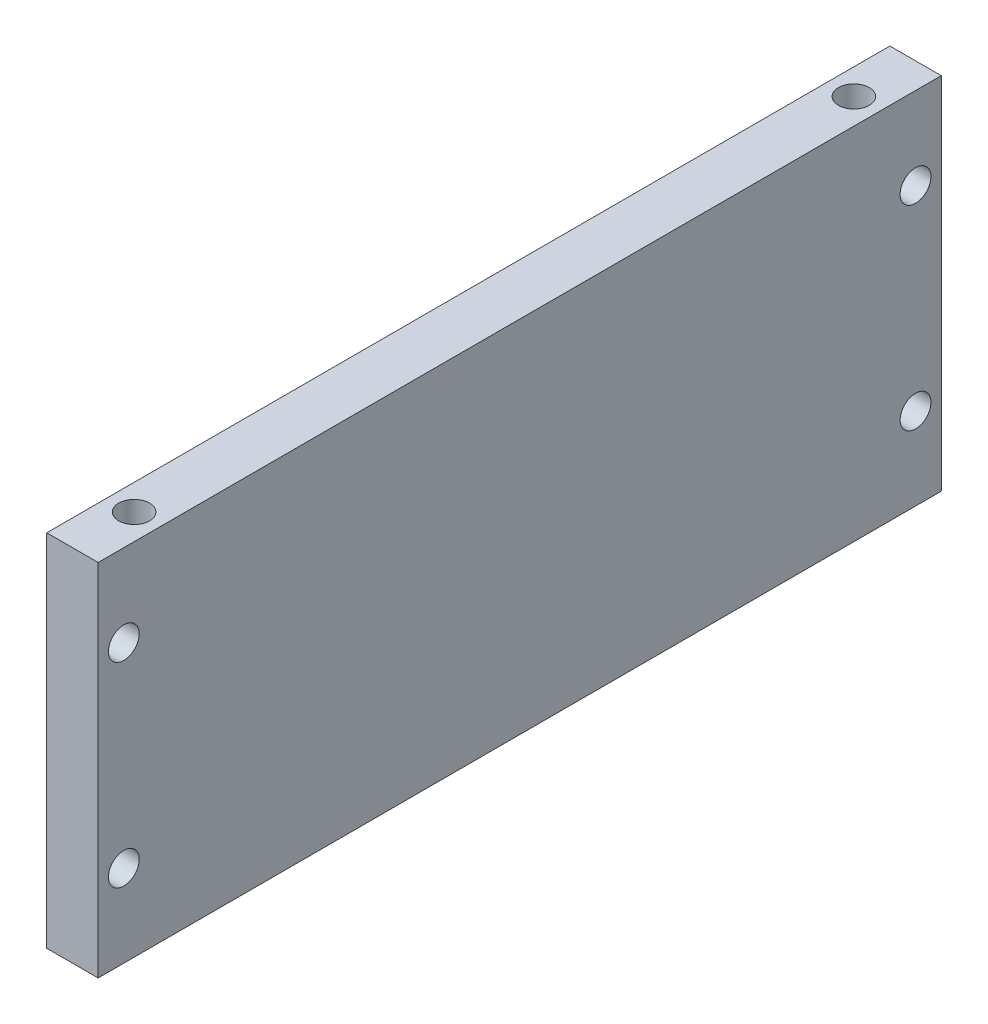
ISO-10303-21;
HEADER;
FILE_DESCRIPTION(('STEP AP214'),'2;1');
FILE_NAME('part.step','',(''),(''),'','','');
FILE_SCHEMA(('AUTOMOTIVE_DESIGN { 1 0 10303 214 1 1 1 1 }'));
ENDSEC;
DATA;
#1=APPLICATION_CONTEXT('core data for automotive mechanical design processes');
#2=APPLICATION_PROTOCOL_DEFINITION('international standard','automotive_design',2000,#1);
#3=PRODUCT_CONTEXT('',#1,'mechanical');
#4=PRODUCT('Part','Part','',(#3));
#5=PRODUCT_RELATED_PRODUCT_CATEGORY('part','',(#4));
#6=PRODUCT_DEFINITION_FORMATION('','',#4);
#7=PRODUCT_DEFINITION_CONTEXT('part definition',#1,'design');
#8=PRODUCT_DEFINITION('design','',#6,#7);
#9=PRODUCT_DEFINITION_SHAPE('','',#8);
#10=(LENGTH_UNIT() NAMED_UNIT(*) SI_UNIT(.MILLI.,.METRE.));
#11=(NAMED_UNIT(*) PLANE_ANGLE_UNIT() SI_UNIT($,.RADIAN.));
#12=(NAMED_UNIT(*) SI_UNIT($,.STERADIAN.) SOLID_ANGLE_UNIT());
#13=UNCERTAINTY_MEASURE_WITH_UNIT(LENGTH_MEASURE(1.E-05),#10,'distance_accuracy_value','');
#14=(GEOMETRIC_REPRESENTATION_CONTEXT(3) GLOBAL_UNCERTAINTY_ASSIGNED_CONTEXT((#13)) GLOBAL_UNIT_ASSIGNED_CONTEXT((#10,
#11,#12)) REPRESENTATION_CONTEXT('',''));
#15=CARTESIAN_POINT('',(0.,0.,0.));
#16=DIRECTION('',(0.,0.,1.));
#17=DIRECTION('',(1.,0.,0.));
#18=AXIS2_PLACEMENT_3D('',#15,#16,#17);
#19=CARTESIAN_POINT('',(5.,-17.5,-41.));
#20=DIRECTION('',(0.,0.,1.));
#21=DIRECTION('',(1.,0.,0.));
#22=AXIS2_PLACEMENT_3D('',#19,#20,#21);
#23=PLANE('',#22);
#24=DIRECTION('',(0.,1.,0.));
#25=VECTOR('',#24,1.);
#26=CARTESIAN_POINT('',(0.,-17.5,-41.));
#27=LINE('',#26,#25);
#28=CARTESIAN_POINT('',(0.,-17.5,-41.));
#29=VERTEX_POINT('',#28);
#30=CARTESIAN_POINT('',(0.,17.5,-41.));
#31=VERTEX_POINT('',#30);
#32=EDGE_CURVE('E104',#29,#31,#27,.T.);
#33=ORIENTED_EDGE('',*,*,#32,.T.);
#34=DIRECTION('',(-1.,0.,0.));
#35=VECTOR('',#34,1.);
#36=CARTESIAN_POINT('',(5.,17.5,-41.));
#37=LINE('',#36,#35);
#38=CARTESIAN_POINT('',(5.,17.5,-41.));
#39=VERTEX_POINT('',#38);
#40=EDGE_CURVE('E11',#39,#31,#37,.T.);
#41=ORIENTED_EDGE('',*,*,#40,.F.);
#42=DIRECTION('',(0.,1.,0.));
#43=VECTOR('',#42,1.);
#44=CARTESIAN_POINT('',(5.,-17.5,-41.));
#45=LINE('',#44,#43);
#46=CARTESIAN_POINT('',(5.,-17.5,-41.));
#47=VERTEX_POINT('',#46);
#48=EDGE_CURVE('E92',#47,#39,#45,.T.);
#49=ORIENTED_EDGE('',*,*,#48,.F.);
#50=DIRECTION('',(-1.,0.,0.));
#51=VECTOR('',#50,1.);
#52=CARTESIAN_POINT('',(5.,-17.5,-41.));
#53=LINE('',#52,#51);
#54=EDGE_CURVE('E100',#47,#29,#53,.T.);
#55=ORIENTED_EDGE('',*,*,#54,.T.);
#56=EDGE_LOOP('',(#33,#41,#49,#55));
#57=FACE_BOUND('',#56,.T.);
#58=ADVANCED_FACE('F41',(#57),#23,.F.);
#59=CARTESIAN_POINT('',(5.,17.5,41.));
#60=DIRECTION('',(0.,-1.,0.));
#61=DIRECTION('',(0.,0.,-1.));
#62=AXIS2_PLACEMENT_3D('',#59,#60,#61);
#63=PLANE('',#62);
#64=CARTESIAN_POINT('',(2.5,17.5,35.));
#65=DIRECTION('',(0.,1.,0.));
#66=DIRECTION('',(0.,0.,1.));
#67=AXIS2_PLACEMENT_3D('',#64,#65,#66);
#68=CIRCLE('',#67,1.5);
#69=CARTESIAN_POINT('',(2.5,17.5,36.5));
#70=VERTEX_POINT('',#69);
#71=EDGE_CURVE('E160',#70,#70,#68,.T.);
#72=ORIENTED_EDGE('',*,*,#71,.F.);
#73=EDGE_LOOP('',(#72));
#74=FACE_BOUND('',#73,.T.);
#75=CARTESIAN_POINT('',(2.5,17.5,-35.));
#76=DIRECTION('',(0.,1.,0.));
#77=DIRECTION('',(0.,0.,-1.));
#78=AXIS2_PLACEMENT_3D('',#75,#76,#77);
#79=CIRCLE('',#78,1.5);
#80=CARTESIAN_POINT('',(2.5,17.5,-36.5));
#81=VERTEX_POINT('',#80);
#82=EDGE_CURVE('E157',#81,#81,#79,.T.);
#83=ORIENTED_EDGE('',*,*,#82,.F.);
#84=EDGE_LOOP('',(#83));
#85=FACE_BOUND('',#84,.T.);
#86=DIRECTION('',(0.,0.,1.));
#87=VECTOR('',#86,1.);
#88=CARTESIAN_POINT('',(0.,17.5,41.));
#89=LINE('',#88,#87);
#90=CARTESIAN_POINT('',(0.,17.5,41.));
#91=VERTEX_POINT('',#90);
#92=EDGE_CURVE('E96',#31,#91,#89,.T.);
#93=ORIENTED_EDGE('',*,*,#92,.T.);
#94=DIRECTION('',(-1.,0.,0.));
#95=VECTOR('',#94,1.);
#96=CARTESIAN_POINT('',(5.,17.5,41.));
#97=LINE('',#96,#95);
#98=CARTESIAN_POINT('',(5.,17.5,41.));
#99=VERTEX_POINT('',#98);
#100=EDGE_CURVE('E49',#99,#91,#97,.T.);
#101=ORIENTED_EDGE('',*,*,#100,.F.);
#102=DIRECTION('',(0.,0.,1.));
#103=VECTOR('',#102,1.);
#104=CARTESIAN_POINT('',(5.,17.5,41.));
#105=LINE('',#104,#103);
#106=EDGE_CURVE('E87',#39,#99,#105,.T.);
#107=ORIENTED_EDGE('',*,*,#106,.F.);
#108=ORIENTED_EDGE('',*,*,#40,.T.);
#109=EDGE_LOOP('',(#93,#101,#107,#108));
#110=FACE_BOUND('',#109,.T.);
#111=ADVANCED_FACE('F95',(#74,#85,#110),#63,.F.);
#112=CARTESIAN_POINT('',(5.,-17.5,41.));
#113=DIRECTION('',(0.,0.,-1.));
#114=DIRECTION('',(-1.,0.,0.));
#115=AXIS2_PLACEMENT_3D('',#112,#113,#114);
#116=PLANE('',#115);
#117=DIRECTION('',(0.,-1.,0.));
#118=VECTOR('',#117,1.);
#119=CARTESIAN_POINT('',(0.,-17.5,41.));
#120=LINE('',#119,#118);
#121=CARTESIAN_POINT('',(0.,-17.5,41.));
#122=VERTEX_POINT('',#121);
#123=EDGE_CURVE('E74',#91,#122,#120,.T.);
#124=ORIENTED_EDGE('',*,*,#123,.T.);
#125=DIRECTION('',(-1.,0.,0.));
#126=VECTOR('',#125,1.);
#127=CARTESIAN_POINT('',(5.,-17.5,41.));
#128=LINE('',#127,#126);
#129=CARTESIAN_POINT('',(5.,-17.5,41.));
#130=VERTEX_POINT('',#129);
#131=EDGE_CURVE('E97',#130,#122,#128,.T.);
#132=ORIENTED_EDGE('',*,*,#131,.F.);
#133=DIRECTION('',(0.,-1.,0.));
#134=VECTOR('',#133,1.);
#135=CARTESIAN_POINT('',(5.,-17.5,41.));
#136=LINE('',#135,#134);
#137=EDGE_CURVE('E90',#99,#130,#136,.T.);
#138=ORIENTED_EDGE('',*,*,#137,.F.);
#139=ORIENTED_EDGE('',*,*,#100,.T.);
#140=EDGE_LOOP('',(#124,#132,#138,#139));
#141=FACE_BOUND('',#140,.T.);
#142=ADVANCED_FACE('F98',(#141),#116,.F.);
#143=CARTESIAN_POINT('',(5.,-17.5,41.));
#144=DIRECTION('',(0.,1.,0.));
#145=DIRECTION('',(0.,0.,1.));
#146=AXIS2_PLACEMENT_3D('',#143,#144,#145);
#147=PLANE('',#146);
#148=CARTESIAN_POINT('',(2.5,-17.5,35.));
#149=DIRECTION('',(0.,-1.,0.));
#150=DIRECTION('',(0.,0.,-1.));
#151=AXIS2_PLACEMENT_3D('',#148,#149,#150);
#152=CIRCLE('',#151,1.5);
#153=CARTESIAN_POINT('',(2.5,-17.5,33.5));
#154=VERTEX_POINT('',#153);
#155=EDGE_CURVE('E149',#154,#154,#152,.T.);
#156=ORIENTED_EDGE('',*,*,#155,.F.);
#157=EDGE_LOOP('',(#156));
#158=FACE_BOUND('',#157,.T.);
#159=CARTESIAN_POINT('',(2.5,-17.5,-35.));
#160=DIRECTION('',(0.,-1.,0.));
#161=DIRECTION('',(0.,0.,1.));
#162=AXIS2_PLACEMENT_3D('',#159,#160,#161);
#163=CIRCLE('',#162,1.5);
#164=CARTESIAN_POINT('',(2.5,-17.5,-33.5));
#165=VERTEX_POINT('',#164);
#166=EDGE_CURVE('E145',#165,#165,#163,.T.);
#167=ORIENTED_EDGE('',*,*,#166,.F.);
#168=EDGE_LOOP('',(#167));
#169=FACE_BOUND('',#168,.T.);
#170=DIRECTION('',(0.,0.,-1.));
#171=VECTOR('',#170,1.);
#172=CARTESIAN_POINT('',(0.,-17.5,41.));
#173=LINE('',#172,#171);
#174=EDGE_CURVE('E80',#122,#29,#173,.T.);
#175=ORIENTED_EDGE('',*,*,#174,.T.);
#176=ORIENTED_EDGE('',*,*,#54,.F.);
#177=DIRECTION('',(0.,0.,-1.));
#178=VECTOR('',#177,1.);
#179=CARTESIAN_POINT('',(5.,-17.5,41.));
#180=LINE('',#179,#178);
#181=EDGE_CURVE('E57',#130,#47,#180,.T.);
#182=ORIENTED_EDGE('',*,*,#181,.F.);
#183=ORIENTED_EDGE('',*,*,#131,.T.);
#184=EDGE_LOOP('',(#175,#176,#182,#183));
#185=FACE_BOUND('',#184,.T.);
#186=ADVANCED_FACE('F112',(#158,#169,#185),#147,.F.);
#187=CARTESIAN_POINT('',(5.,0.,0.));
#188=DIRECTION('',(-1.,0.,0.));
#189=DIRECTION('',(0.,0.,1.));
#190=AXIS2_PLACEMENT_3D('',#187,#188,#189);
#191=PLANE('',#190);
#192=CARTESIAN_POINT('',(5.,9.49999999999999,-38.5));
#193=DIRECTION('',(1.,0.,0.));
#194=DIRECTION('',(0.,0.,1.));
#195=AXIS2_PLACEMENT_3D('',#192,#193,#194);
#196=CIRCLE('',#195,1.5);
#197=CARTESIAN_POINT('',(5.,9.49999999999999,-37.));
#198=VERTEX_POINT('',#197);
#199=EDGE_CURVE('E127',#198,#198,#196,.T.);
#200=ORIENTED_EDGE('',*,*,#199,.F.);
#201=EDGE_LOOP('',(#200));
#202=FACE_BOUND('',#201,.T.);
#203=CARTESIAN_POINT('',(5.,-9.49999999999999,-38.5));
#204=DIRECTION('',(1.,0.,0.));
#205=DIRECTION('',(0.,0.,-1.));
#206=AXIS2_PLACEMENT_3D('',#203,#204,#205);
#207=CIRCLE('',#206,1.5);
#208=CARTESIAN_POINT('',(5.,-9.49999999999999,-40.));
#209=VERTEX_POINT('',#208);
#210=EDGE_CURVE('E134',#209,#209,#207,.T.);
#211=ORIENTED_EDGE('',*,*,#210,.F.);
#212=EDGE_LOOP('',(#211));
#213=FACE_BOUND('',#212,.T.);
#214=CARTESIAN_POINT('',(5.,-9.49999999999999,38.5));
#215=DIRECTION('',(1.,0.,0.));
#216=DIRECTION('',(0.,0.,1.));
#217=AXIS2_PLACEMENT_3D('',#214,#215,#216);
#218=CIRCLE('',#217,1.5);
#219=CARTESIAN_POINT('',(5.,-9.49999999999999,40.));
#220=VERTEX_POINT('',#219);
#221=EDGE_CURVE('E121',#220,#220,#218,.T.);
#222=ORIENTED_EDGE('',*,*,#221,.F.);
#223=EDGE_LOOP('',(#222));
#224=FACE_BOUND('',#223,.T.);
#225=CARTESIAN_POINT('',(5.,9.49999999999999,38.5));
#226=DIRECTION('',(1.,0.,0.));
#227=DIRECTION('',(0.,0.,-1.));
#228=AXIS2_PLACEMENT_3D('',#225,#226,#227);
#229=CIRCLE('',#228,1.5);
#230=CARTESIAN_POINT('',(5.,9.49999999999999,37.));
#231=VERTEX_POINT('',#230);
#232=EDGE_CURVE('E118',#231,#231,#229,.T.);
#233=ORIENTED_EDGE('',*,*,#232,.F.);
#234=EDGE_LOOP('',(#233));
#235=FACE_BOUND('',#234,.T.);
#236=ORIENTED_EDGE('',*,*,#48,.T.);
#237=ORIENTED_EDGE('',*,*,#106,.T.);
#238=ORIENTED_EDGE('',*,*,#137,.T.);
#239=ORIENTED_EDGE('',*,*,#181,.T.);
#240=EDGE_LOOP('',(#236,#237,#238,#239));
#241=FACE_BOUND('',#240,.T.);
#242=ADVANCED_FACE('F88',(#202,#213,#224,#235,#241),#191,.F.);
#243=CARTESIAN_POINT('',(0.,0.,0.));
#244=DIRECTION('',(-1.,0.,0.));
#245=DIRECTION('',(0.,0.,1.));
#246=AXIS2_PLACEMENT_3D('',#243,#244,#245);
#247=PLANE('',#246);
#248=ORIENTED_EDGE('',*,*,#32,.F.);
#249=ORIENTED_EDGE('',*,*,#174,.F.);
#250=ORIENTED_EDGE('',*,*,#123,.F.);
#251=ORIENTED_EDGE('',*,*,#92,.F.);
#252=EDGE_LOOP('',(#248,#249,#250,#251));
#253=FACE_BOUND('',#252,.T.);
#254=ADVANCED_FACE('F115',(#253),#247,.T.);
#255=CARTESIAN_POINT('',(1.,9.49999999999999,38.5));
#256=DIRECTION('',(1.,0.,0.));
#257=DIRECTION('',(0.,0.,-1.));
#258=AXIS2_PLACEMENT_3D('',#255,#256,#257);
#259=CYLINDRICAL_SURFACE('',#258,1.5);
#260=CARTESIAN_POINT('',(1.,9.49999999999999,38.5));
#261=DIRECTION('',(1.,0.,0.));
#262=DIRECTION('',(0.,0.,-1.));
#263=AXIS2_PLACEMENT_3D('',#260,#261,#262);
#264=CIRCLE('',#263,1.5);
#265=CARTESIAN_POINT('',(1.,9.49999999999999,37.));
#266=VERTEX_POINT('',#265);
#267=EDGE_CURVE('E107',#266,#266,#264,.T.);
#268=ORIENTED_EDGE('',*,*,#267,.F.);
#269=EDGE_LOOP('',(#268));
#270=FACE_BOUND('',#269,.T.);
#271=ORIENTED_EDGE('',*,*,#232,.T.);
#272=EDGE_LOOP('',(#271));
#273=FACE_BOUND('',#272,.T.);
#274=ADVANCED_FACE('F231',(#270,#273),#259,.F.);
#275=CARTESIAN_POINT('',(1.,9.49999999999999,38.5));
#276=DIRECTION('',(1.,0.,0.));
#277=DIRECTION('',(0.,0.,-1.));
#278=AXIS2_PLACEMENT_3D('',#275,#276,#277);
#279=PLANE('',#278);
#280=ORIENTED_EDGE('',*,*,#267,.T.);
#281=EDGE_LOOP('',(#280));
#282=FACE_BOUND('',#281,.T.);
#283=ADVANCED_FACE('F237',(#282),#279,.T.);
#284=CARTESIAN_POINT('',(1.,-9.49999999999999,38.5));
#285=DIRECTION('',(1.,0.,0.));
#286=DIRECTION('',(0.,0.,-1.));
#287=AXIS2_PLACEMENT_3D('',#284,#285,#286);
#288=CYLINDRICAL_SURFACE('',#287,1.5);
#289=CARTESIAN_POINT('',(1.,-9.49999999999999,38.5));
#290=DIRECTION('',(1.,0.,0.));
#291=DIRECTION('',(0.,0.,1.));
#292=AXIS2_PLACEMENT_3D('',#289,#290,#291);
#293=CIRCLE('',#292,1.5);
#294=CARTESIAN_POINT('',(1.,-9.49999999999999,40.));
#295=VERTEX_POINT('',#294);
#296=EDGE_CURVE('E137',#295,#295,#293,.T.);
#297=ORIENTED_EDGE('',*,*,#296,.F.);
#298=EDGE_LOOP('',(#297));
#299=FACE_BOUND('',#298,.T.);
#300=ORIENTED_EDGE('',*,*,#221,.T.);
#301=EDGE_LOOP('',(#300));
#302=FACE_BOUND('',#301,.T.);
#303=ADVANCED_FACE('F245',(#299,#302),#288,.F.);
#304=CARTESIAN_POINT('',(1.,-9.49999999999999,38.5));
#305=DIRECTION('',(-1.,0.,0.));
#306=DIRECTION('',(0.,0.,1.));
#307=AXIS2_PLACEMENT_3D('',#304,#305,#306);
#308=PLANE('',#307);
#309=ORIENTED_EDGE('',*,*,#296,.T.);
#310=EDGE_LOOP('',(#309));
#311=FACE_BOUND('',#310,.T.);
#312=ADVANCED_FACE('F253',(#311),#308,.F.);
#313=CARTESIAN_POINT('',(1.,-9.49999999999999,-38.5));
#314=DIRECTION('',(1.,0.,0.));
#315=DIRECTION('',(0.,0.,-1.));
#316=AXIS2_PLACEMENT_3D('',#313,#314,#315);
#317=CYLINDRICAL_SURFACE('',#316,1.5);
#318=CARTESIAN_POINT('',(1.,-9.49999999999999,-38.5));
#319=DIRECTION('',(1.,0.,0.));
#320=DIRECTION('',(0.,0.,-1.));
#321=AXIS2_PLACEMENT_3D('',#318,#319,#320);
#322=CIRCLE('',#321,1.5);
#323=CARTESIAN_POINT('',(1.,-9.49999999999999,-40.));
#324=VERTEX_POINT('',#323);
#325=EDGE_CURVE('E131',#324,#324,#322,.T.);
#326=ORIENTED_EDGE('',*,*,#325,.F.);
#327=EDGE_LOOP('',(#326));
#328=FACE_BOUND('',#327,.T.);
#329=ORIENTED_EDGE('',*,*,#210,.T.);
#330=EDGE_LOOP('',(#329));
#331=FACE_BOUND('',#330,.T.);
#332=ADVANCED_FACE('F261',(#328,#331),#317,.F.);
#333=CARTESIAN_POINT('',(1.,-9.49999999999999,-38.5));
#334=DIRECTION('',(1.,0.,0.));
#335=DIRECTION('',(0.,0.,-1.));
#336=AXIS2_PLACEMENT_3D('',#333,#334,#335);
#337=PLANE('',#336);
#338=ORIENTED_EDGE('',*,*,#325,.T.);
#339=EDGE_LOOP('',(#338));
#340=FACE_BOUND('',#339,.T.);
#341=ADVANCED_FACE('F269',(#340),#337,.T.);
#342=CARTESIAN_POINT('',(1.,9.49999999999999,-38.5));
#343=DIRECTION('',(1.,0.,0.));
#344=DIRECTION('',(0.,0.,-1.));
#345=AXIS2_PLACEMENT_3D('',#342,#343,#344);
#346=CYLINDRICAL_SURFACE('',#345,1.5);
#347=CARTESIAN_POINT('',(1.,9.49999999999999,-38.5));
#348=DIRECTION('',(1.,0.,0.));
#349=DIRECTION('',(0.,0.,1.));
#350=AXIS2_PLACEMENT_3D('',#347,#348,#349);
#351=CIRCLE('',#350,1.5);
#352=CARTESIAN_POINT('',(1.,9.49999999999999,-37.));
#353=VERTEX_POINT('',#352);
#354=EDGE_CURVE('E124',#353,#353,#351,.T.);
#355=ORIENTED_EDGE('',*,*,#354,.F.);
#356=EDGE_LOOP('',(#355));
#357=FACE_BOUND('',#356,.T.);
#358=ORIENTED_EDGE('',*,*,#199,.T.);
#359=EDGE_LOOP('',(#358));
#360=FACE_BOUND('',#359,.T.);
#361=ADVANCED_FACE('F277',(#357,#360),#346,.F.);
#362=CARTESIAN_POINT('',(1.,9.49999999999999,-38.5));
#363=DIRECTION('',(-1.,0.,0.));
#364=DIRECTION('',(0.,0.,1.));
#365=AXIS2_PLACEMENT_3D('',#362,#363,#364);
#366=PLANE('',#365);
#367=ORIENTED_EDGE('',*,*,#354,.T.);
#368=EDGE_LOOP('',(#367));
#369=FACE_BOUND('',#368,.T.);
#370=ADVANCED_FACE('F285',(#369),#366,.F.);
#371=CARTESIAN_POINT('',(2.5,-13.5,-35.));
#372=DIRECTION('',(0.,-1.,0.));
#373=DIRECTION('',(0.,0.,-1.));
#374=AXIS2_PLACEMENT_3D('',#371,#372,#373);
#375=CYLINDRICAL_SURFACE('',#374,1.5);
#376=CARTESIAN_POINT('',(2.5,-13.5,-35.));
#377=DIRECTION('',(0.,-1.,0.));
#378=DIRECTION('',(0.,0.,1.));
#379=AXIS2_PLACEMENT_3D('',#376,#377,#378);
#380=CIRCLE('',#379,1.5);
#381=CARTESIAN_POINT('',(2.5,-13.5,-33.5));
#382=VERTEX_POINT('',#381);
#383=EDGE_CURVE('E142',#382,#382,#380,.T.);
#384=ORIENTED_EDGE('',*,*,#383,.F.);
#385=EDGE_LOOP('',(#384));
#386=FACE_BOUND('',#385,.T.);
#387=ORIENTED_EDGE('',*,*,#166,.T.);
#388=EDGE_LOOP('',(#387));
#389=FACE_BOUND('',#388,.T.);
#390=ADVANCED_FACE('F292',(#386,#389),#375,.F.);
#391=CARTESIAN_POINT('',(2.5,-13.5,-35.));
#392=DIRECTION('',(0.,1.,0.));
#393=DIRECTION('',(0.,0.,1.));
#394=AXIS2_PLACEMENT_3D('',#391,#392,#393);
#395=PLANE('',#394);
#396=ORIENTED_EDGE('',*,*,#383,.T.);
#397=EDGE_LOOP('',(#396));
#398=FACE_BOUND('',#397,.T.);
#399=ADVANCED_FACE('F299',(#398),#395,.F.);
#400=CARTESIAN_POINT('',(2.5,-13.5,35.));
#401=DIRECTION('',(0.,-1.,0.));
#402=DIRECTION('',(0.,0.,-1.));
#403=AXIS2_PLACEMENT_3D('',#400,#401,#402);
#404=CYLINDRICAL_SURFACE('',#403,1.5);
#405=CARTESIAN_POINT('',(2.5,-13.5,35.));
#406=DIRECTION('',(0.,-1.,0.));
#407=DIRECTION('',(0.,0.,-1.));
#408=AXIS2_PLACEMENT_3D('',#405,#406,#407);
#409=CIRCLE('',#408,1.5);
#410=CARTESIAN_POINT('',(2.5,-13.5,33.5));
#411=VERTEX_POINT('',#410);
#412=EDGE_CURVE('E128',#411,#411,#409,.T.);
#413=ORIENTED_EDGE('',*,*,#412,.F.);
#414=EDGE_LOOP('',(#413));
#415=FACE_BOUND('',#414,.T.);
#416=ORIENTED_EDGE('',*,*,#155,.T.);
#417=EDGE_LOOP('',(#416));
#418=FACE_BOUND('',#417,.T.);
#419=ADVANCED_FACE('F190',(#415,#418),#404,.F.);
#420=CARTESIAN_POINT('',(2.5,-13.5,35.));
#421=DIRECTION('',(0.,-1.,0.));
#422=DIRECTION('',(0.,0.,-1.));
#423=AXIS2_PLACEMENT_3D('',#420,#421,#422);
#424=PLANE('',#423);
#425=ORIENTED_EDGE('',*,*,#412,.T.);
#426=EDGE_LOOP('',(#425));
#427=FACE_BOUND('',#426,.T.);
#428=ADVANCED_FACE('F181',(#427),#424,.T.);
#429=CARTESIAN_POINT('',(2.5,13.5,-35.));
#430=DIRECTION('',(0.,1.,0.));
#431=DIRECTION('',(0.,0.,1.));
#432=AXIS2_PLACEMENT_3D('',#429,#430,#431);
#433=CYLINDRICAL_SURFACE('',#432,1.5);
#434=CARTESIAN_POINT('',(2.5,13.5,-35.));
#435=DIRECTION('',(0.,1.,0.));
#436=DIRECTION('',(0.,0.,-1.));
#437=AXIS2_PLACEMENT_3D('',#434,#435,#436);
#438=CIRCLE('',#437,1.5);
#439=CARTESIAN_POINT('',(2.5,13.5,-36.5));
#440=VERTEX_POINT('',#439);
#441=EDGE_CURVE('E154',#440,#440,#438,.T.);
#442=ORIENTED_EDGE('',*,*,#441,.F.);
#443=EDGE_LOOP('',(#442));
#444=FACE_BOUND('',#443,.T.);
#445=ORIENTED_EDGE('',*,*,#82,.T.);
#446=EDGE_LOOP('',(#445));
#447=FACE_BOUND('',#446,.T.);
#448=ADVANCED_FACE('F179',(#444,#447),#433,.F.);
#449=CARTESIAN_POINT('',(2.5,13.5,-35.));
#450=DIRECTION('',(0.,-1.,0.));
#451=DIRECTION('',(0.,0.,-1.));
#452=AXIS2_PLACEMENT_3D('',#449,#450,#451);
#453=PLANE('',#452);
#454=ORIENTED_EDGE('',*,*,#441,.T.);
#455=EDGE_LOOP('',(#454));
#456=FACE_BOUND('',#455,.T.);
#457=ADVANCED_FACE('F171',(#456),#453,.F.);
#458=CARTESIAN_POINT('',(2.5,13.5,35.));
#459=DIRECTION('',(0.,1.,0.));
#460=DIRECTION('',(0.,0.,1.));
#461=AXIS2_PLACEMENT_3D('',#458,#459,#460);
#462=CYLINDRICAL_SURFACE('',#461,1.5);
#463=CARTESIAN_POINT('',(2.5,13.5,35.));
#464=DIRECTION('',(0.,1.,0.));
#465=DIRECTION('',(0.,0.,1.));
#466=AXIS2_PLACEMENT_3D('',#463,#464,#465);
#467=CIRCLE('',#466,1.5);
#468=CARTESIAN_POINT('',(2.5,13.5,36.5));
#469=VERTEX_POINT('',#468);
#470=EDGE_CURVE('E146',#469,#469,#467,.T.);
#471=ORIENTED_EDGE('',*,*,#470,.F.);
#472=EDGE_LOOP('',(#471));
#473=FACE_BOUND('',#472,.T.);
#474=ORIENTED_EDGE('',*,*,#71,.T.);
#475=EDGE_LOOP('',(#474));
#476=FACE_BOUND('',#475,.T.);
#477=ADVANCED_FACE('F168',(#473,#476),#462,.F.);
#478=CARTESIAN_POINT('',(2.5,13.5,35.));
#479=DIRECTION('',(0.,1.,0.));
#480=DIRECTION('',(0.,0.,1.));
#481=AXIS2_PLACEMENT_3D('',#478,#479,#480);
#482=PLANE('',#481);
#483=ORIENTED_EDGE('',*,*,#470,.T.);
#484=EDGE_LOOP('',(#483));
#485=FACE_BOUND('',#484,.T.);
#486=ADVANCED_FACE('F166',(#485),#482,.T.);
#487=CLOSED_SHELL('',(#58,#111,#142,#186,#242,#254,#274,#283,#303,#312,#332,#341,#361,#370,#390,
#399,#419,#428,#448,#457,#477,#486));
#488=MANIFOLD_SOLID_BREP('B2',#487);
#489=ADVANCED_BREP_SHAPE_REPRESENTATION('',(#18,#488),#14);
#490=SHAPE_DEFINITION_REPRESENTATION(#9,#489);
ENDSEC;
END-ISO-10303-21;
